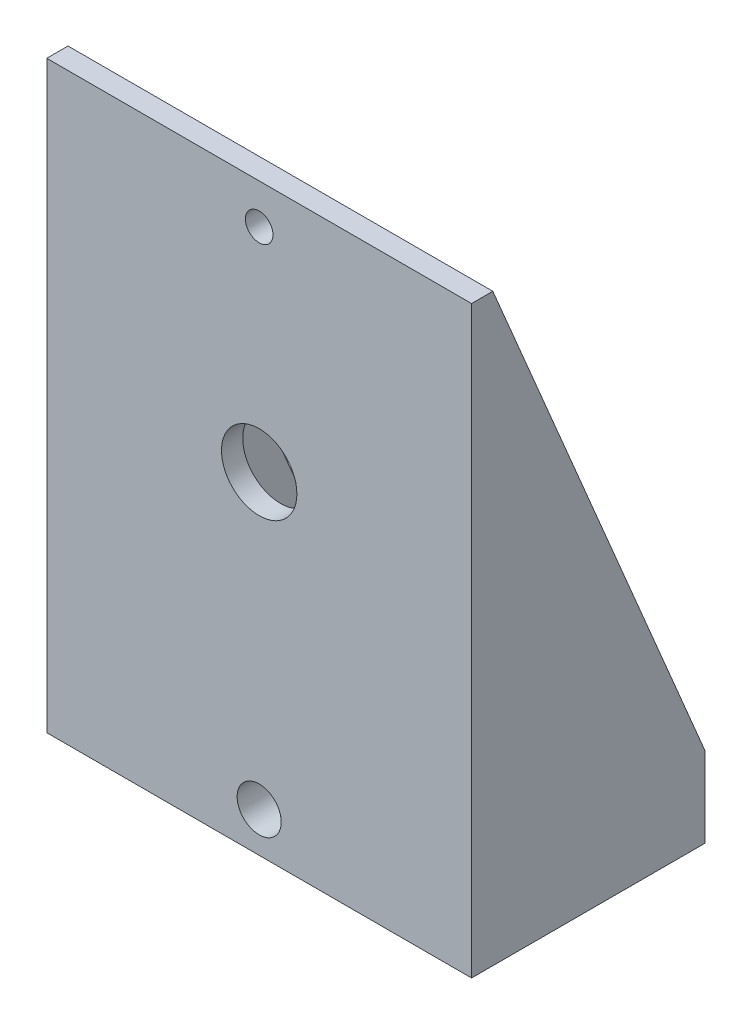
ISO-10303-21;
HEADER;
FILE_DESCRIPTION(('STEP AP214'),'2;1');
FILE_NAME('part.step','',(''),(''),'','','');
FILE_SCHEMA(('AUTOMOTIVE_DESIGN { 1 0 10303 214 1 1 1 1 }'));
ENDSEC;
DATA;
#1=APPLICATION_CONTEXT('core data for automotive mechanical design processes');
#2=APPLICATION_PROTOCOL_DEFINITION('international standard','automotive_design',2000,#1);
#3=PRODUCT_CONTEXT('',#1,'mechanical');
#4=PRODUCT('Part','Part','',(#3));
#5=PRODUCT_RELATED_PRODUCT_CATEGORY('part','',(#4));
#6=PRODUCT_DEFINITION_FORMATION('','',#4);
#7=PRODUCT_DEFINITION_CONTEXT('part definition',#1,'design');
#8=PRODUCT_DEFINITION('design','',#6,#7);
#9=PRODUCT_DEFINITION_SHAPE('','',#8);
#10=(LENGTH_UNIT() NAMED_UNIT(*) SI_UNIT(.MILLI.,.METRE.));
#11=(NAMED_UNIT(*) PLANE_ANGLE_UNIT() SI_UNIT($,.RADIAN.));
#12=(NAMED_UNIT(*) SI_UNIT($,.STERADIAN.) SOLID_ANGLE_UNIT());
#13=UNCERTAINTY_MEASURE_WITH_UNIT(LENGTH_MEASURE(1.E-05),#10,'distance_accuracy_value','');
#14=(GEOMETRIC_REPRESENTATION_CONTEXT(3) GLOBAL_UNCERTAINTY_ASSIGNED_CONTEXT((#13)) GLOBAL_UNIT_ASSIGNED_CONTEXT((#10,
#11,#12)) REPRESENTATION_CONTEXT('',''));
#15=CARTESIAN_POINT('',(0.,0.,0.));
#16=DIRECTION('',(0.,0.,1.));
#17=DIRECTION('',(1.,0.,0.));
#18=AXIS2_PLACEMENT_3D('',#15,#16,#17);
#19=CARTESIAN_POINT('',(0.,0.,0.));
#20=DIRECTION('',(0.,0.,1.));
#21=DIRECTION('',(1.,0.,0.));
#22=AXIS2_PLACEMENT_3D('',#19,#20,#21);
#23=PLANE('',#22);
#24=CARTESIAN_POINT('',(40.,-47.5,0.));
#25=DIRECTION('',(0.,0.,1.));
#26=DIRECTION('',(1.,0.,0.));
#27=AXIS2_PLACEMENT_3D('',#24,#25,#26);
#28=CIRCLE('',#27,7.1);
#29=CARTESIAN_POINT('',(47.1,-47.5,0.));
#30=VERTEX_POINT('',#29);
#31=EDGE_CURVE('E147',#30,#30,#28,.T.);
#32=ORIENTED_EDGE('',*,*,#31,.T.);
#33=EDGE_LOOP('',(#32));
#34=FACE_BOUND('',#33,.T.);
#35=CARTESIAN_POINT('',(40.,-7.50000000000001,0.));
#36=DIRECTION('',(0.,0.,1.));
#37=DIRECTION('',(1.,0.,0.));
#38=AXIS2_PLACEMENT_3D('',#35,#36,#37);
#39=CIRCLE('',#38,2.6);
#40=CARTESIAN_POINT('',(42.6,-7.50000000000001,0.));
#41=VERTEX_POINT('',#40);
#42=EDGE_CURVE('E160',#41,#41,#39,.T.);
#43=ORIENTED_EDGE('',*,*,#42,.T.);
#44=EDGE_LOOP('',(#43));
#45=FACE_BOUND('',#44,.T.);
#46=DIRECTION('',(0.,1.,0.));
#47=VECTOR('',#46,1.);
#48=CARTESIAN_POINT('',(7.,0.,0.));
#49=LINE('',#48,#47);
#50=CARTESIAN_POINT('',(7.00000000000001,-95.,0.));
#51=VERTEX_POINT('',#50);
#52=CARTESIAN_POINT('',(7.,0.,0.));
#53=VERTEX_POINT('',#52);
#54=EDGE_CURVE('E108',#51,#53,#49,.T.);
#55=ORIENTED_EDGE('',*,*,#54,.T.);
#56=DIRECTION('',(-1.,0.,0.));
#57=VECTOR('',#56,1.);
#58=CARTESIAN_POINT('',(0.,0.,0.));
#59=LINE('',#58,#57);
#60=CARTESIAN_POINT('',(73.,0.,0.));
#61=VERTEX_POINT('',#60);
#62=EDGE_CURVE('E151',#61,#53,#59,.T.);
#63=ORIENTED_EDGE('',*,*,#62,.F.);
#64=DIRECTION('',(0.,-1.,0.));
#65=VECTOR('',#64,1.);
#66=CARTESIAN_POINT('',(73.,0.,0.));
#67=LINE('',#66,#65);
#68=CARTESIAN_POINT('',(73.,-95.,0.));
#69=VERTEX_POINT('',#68);
#70=EDGE_CURVE('E130',#61,#69,#67,.T.);
#71=ORIENTED_EDGE('',*,*,#70,.T.);
#72=DIRECTION('',(1.,0.,0.));
#73=VECTOR('',#72,1.);
#74=CARTESIAN_POINT('',(80.,-95.,0.));
#75=LINE('',#74,#73);
#76=EDGE_CURVE('E123',#51,#69,#75,.T.);
#77=ORIENTED_EDGE('',*,*,#76,.F.);
#78=EDGE_LOOP('',(#55,#63,#71,#77));
#79=FACE_BOUND('',#78,.T.);
#80=ADVANCED_FACE('F43',(#34,#45,#79),#23,.F.);
#81=CARTESIAN_POINT('',(80.,-95.,-40.));
#82=DIRECTION('',(0.,-1.,0.));
#83=DIRECTION('',(0.,0.,-1.));
#84=AXIS2_PLACEMENT_3D('',#81,#82,#83);
#85=PLANE('',#84);
#86=DIRECTION('',(0.,0.,1.));
#87=VECTOR('',#86,1.);
#88=CARTESIAN_POINT('',(7.00000000000001,-95.,0.));
#89=LINE('',#88,#87);
#90=CARTESIAN_POINT('',(7.00000000000001,-95.,-40.));
#91=VERTEX_POINT('',#90);
#92=EDGE_CURVE('E111',#91,#51,#89,.T.);
#93=ORIENTED_EDGE('',*,*,#92,.T.);
#94=ORIENTED_EDGE('',*,*,#76,.T.);
#95=DIRECTION('',(0.,0.,-1.));
#96=VECTOR('',#95,1.);
#97=CARTESIAN_POINT('',(73.,-95.,0.));
#98=LINE('',#97,#96);
#99=CARTESIAN_POINT('',(73.,-95.,-40.));
#100=VERTEX_POINT('',#99);
#101=EDGE_CURVE('E213',#69,#100,#98,.T.);
#102=ORIENTED_EDGE('',*,*,#101,.T.);
#103=DIRECTION('',(1.,0.,0.));
#104=VECTOR('',#103,1.);
#105=CARTESIAN_POINT('',(80.,-95.,-40.));
#106=LINE('',#105,#104);
#107=EDGE_CURVE('E125',#91,#100,#106,.T.);
#108=ORIENTED_EDGE('',*,*,#107,.F.);
#109=EDGE_LOOP('',(#93,#94,#102,#108));
#110=FACE_BOUND('',#109,.T.);
#111=ADVANCED_FACE('F121',(#110),#85,.F.);
#112=CARTESIAN_POINT('',(0.,0.,4.));
#113=DIRECTION('',(1.,0.,0.));
#114=DIRECTION('',(0.,1.,0.));
#115=AXIS2_PLACEMENT_3D('',#112,#113,#114);
#116=PLANE('',#115);
#117=DIRECTION('',(0.,0.,-1.));
#118=VECTOR('',#117,1.);
#119=CARTESIAN_POINT('',(0.,0.,4.));
#120=LINE('',#119,#118);
#121=CARTESIAN_POINT('',(0.,0.,4.));
#122=VERTEX_POINT('',#121);
#123=CARTESIAN_POINT('',(0.,0.,0.));
#124=VERTEX_POINT('',#123);
#125=EDGE_CURVE('E176',#122,#124,#120,.T.);
#126=ORIENTED_EDGE('',*,*,#125,.T.);
#127=DIRECTION('',(0.,-0.921635375138065,-0.388057000058133));
#128=VECTOR('',#127,1.);
#129=CARTESIAN_POINT('',(0.,-95.,-40.));
#130=LINE('',#129,#128);
#131=CARTESIAN_POINT('',(0.,-95.,-40.));
#132=VERTEX_POINT('',#131);
#133=EDGE_CURVE('E227',#124,#132,#130,.T.);
#134=ORIENTED_EDGE('',*,*,#133,.T.);
#135=DIRECTION('',(0.,1.,0.));
#136=VECTOR('',#135,1.);
#137=CARTESIAN_POINT('',(0.,-95.,-40.));
#138=LINE('',#137,#136);
#139=CARTESIAN_POINT('',(0.,-110.,-40.));
#140=VERTEX_POINT('',#139);
#141=EDGE_CURVE('E203',#140,#132,#138,.T.);
#142=ORIENTED_EDGE('',*,*,#141,.F.);
#143=DIRECTION('',(0.,0.,-1.));
#144=VECTOR('',#143,1.);
#145=CARTESIAN_POINT('',(0.,-110.,4.));
#146=LINE('',#145,#144);
#147=CARTESIAN_POINT('',(0.,-110.,4.));
#148=VERTEX_POINT('',#147);
#149=EDGE_CURVE('E11',#148,#140,#146,.T.);
#150=ORIENTED_EDGE('',*,*,#149,.F.);
#151=DIRECTION('',(0.,-1.,0.));
#152=VECTOR('',#151,1.);
#153=CARTESIAN_POINT('',(0.,0.,4.));
#154=LINE('',#153,#152);
#155=EDGE_CURVE('E164',#122,#148,#154,.T.);
#156=ORIENTED_EDGE('',*,*,#155,.F.);
#157=EDGE_LOOP('',(#126,#134,#142,#150,#156));
#158=FACE_BOUND('',#157,.T.);
#159=ADVANCED_FACE('F45',(#158),#116,.F.);
#160=CARTESIAN_POINT('',(0.,-110.,4.));
#161=DIRECTION('',(0.,1.,0.));
#162=DIRECTION('',(0.,0.,1.));
#163=AXIS2_PLACEMENT_3D('',#160,#161,#162);
#164=PLANE('',#163);
#165=ORIENTED_EDGE('',*,*,#149,.T.);
#166=DIRECTION('',(-1.,0.,0.));
#167=VECTOR('',#166,1.);
#168=CARTESIAN_POINT('',(80.,-110.,-40.));
#169=LINE('',#168,#167);
#170=CARTESIAN_POINT('',(80.,-110.,-40.));
#171=VERTEX_POINT('',#170);
#172=EDGE_CURVE('E138',#171,#140,#169,.T.);
#173=ORIENTED_EDGE('',*,*,#172,.F.);
#174=DIRECTION('',(0.,0.,-1.));
#175=VECTOR('',#174,1.);
#176=CARTESIAN_POINT('',(80.,-110.,4.));
#177=LINE('',#176,#175);
#178=CARTESIAN_POINT('',(80.,-110.,4.));
#179=VERTEX_POINT('',#178);
#180=EDGE_CURVE('E52',#179,#171,#177,.T.);
#181=ORIENTED_EDGE('',*,*,#180,.F.);
#182=DIRECTION('',(1.,0.,0.));
#183=VECTOR('',#182,1.);
#184=CARTESIAN_POINT('',(0.,-110.,4.));
#185=LINE('',#184,#183);
#186=EDGE_CURVE('E167',#148,#179,#185,.T.);
#187=ORIENTED_EDGE('',*,*,#186,.F.);
#188=EDGE_LOOP('',(#165,#173,#181,#187));
#189=FACE_BOUND('',#188,.T.);
#190=ADVANCED_FACE('F197',(#189),#164,.F.);
#191=CARTESIAN_POINT('',(80.,0.,4.));
#192=DIRECTION('',(-1.,0.,0.));
#193=DIRECTION('',(0.,-1.,0.));
#194=AXIS2_PLACEMENT_3D('',#191,#192,#193);
#195=PLANE('',#194);
#196=DIRECTION('',(0.,0.921635375138065,0.388057000058133));
#197=VECTOR('',#196,1.);
#198=CARTESIAN_POINT('',(80.,-95.,-40.));
#199=LINE('',#198,#197);
#200=CARTESIAN_POINT('',(80.,-95.,-40.));
#201=VERTEX_POINT('',#200);
#202=CARTESIAN_POINT('',(80.,0.,0.));
#203=VERTEX_POINT('',#202);
#204=EDGE_CURVE('E221',#201,#203,#199,.T.);
#205=ORIENTED_EDGE('',*,*,#204,.T.);
#206=DIRECTION('',(0.,0.,-1.));
#207=VECTOR('',#206,1.);
#208=CARTESIAN_POINT('',(80.,0.,4.));
#209=LINE('',#208,#207);
#210=CARTESIAN_POINT('',(80.,0.,4.));
#211=VERTEX_POINT('',#210);
#212=EDGE_CURVE('E183',#211,#203,#209,.T.);
#213=ORIENTED_EDGE('',*,*,#212,.F.);
#214=DIRECTION('',(0.,1.,0.));
#215=VECTOR('',#214,1.);
#216=CARTESIAN_POINT('',(80.,0.,4.));
#217=LINE('',#216,#215);
#218=EDGE_CURVE('E171',#179,#211,#217,.T.);
#219=ORIENTED_EDGE('',*,*,#218,.F.);
#220=ORIENTED_EDGE('',*,*,#180,.T.);
#221=DIRECTION('',(0.,-1.,0.));
#222=VECTOR('',#221,1.);
#223=CARTESIAN_POINT('',(80.,-95.,-40.));
#224=LINE('',#223,#222);
#225=EDGE_CURVE('E132',#201,#171,#224,.T.);
#226=ORIENTED_EDGE('',*,*,#225,.F.);
#227=EDGE_LOOP('',(#205,#213,#219,#220,#226));
#228=FACE_BOUND('',#227,.T.);
#229=ADVANCED_FACE('F193',(#228),#195,.F.);
#230=CARTESIAN_POINT('',(0.,0.,4.));
#231=DIRECTION('',(0.,-1.,0.));
#232=DIRECTION('',(0.,0.,-1.));
#233=AXIS2_PLACEMENT_3D('',#230,#231,#232);
#234=PLANE('',#233);
#235=EDGE_CURVE('E168',#203,#61,#59,.T.);
#236=ORIENTED_EDGE('',*,*,#235,.T.);
#237=ORIENTED_EDGE('',*,*,#62,.T.);
#238=DIRECTION('',(-1.,0.,0.));
#239=VECTOR('',#238,1.);
#240=CARTESIAN_POINT('',(7.,0.,0.));
#241=LINE('',#240,#239);
#242=EDGE_CURVE('E118',#53,#124,#241,.T.);
#243=ORIENTED_EDGE('',*,*,#242,.T.);
#244=ORIENTED_EDGE('',*,*,#125,.F.);
#245=DIRECTION('',(-1.,0.,0.));
#246=VECTOR('',#245,1.);
#247=CARTESIAN_POINT('',(0.,0.,4.));
#248=LINE('',#247,#246);
#249=EDGE_CURVE('E67',#211,#122,#248,.T.);
#250=ORIENTED_EDGE('',*,*,#249,.F.);
#251=ORIENTED_EDGE('',*,*,#212,.T.);
#252=EDGE_LOOP('',(#236,#237,#243,#244,#250,#251));
#253=FACE_BOUND('',#252,.T.);
#254=ADVANCED_FACE('F244',(#253),#234,.F.);
#255=CARTESIAN_POINT('',(0.,0.,4.));
#256=DIRECTION('',(0.,0.,1.));
#257=DIRECTION('',(1.,0.,0.));
#258=AXIS2_PLACEMENT_3D('',#255,#256,#257);
#259=PLANE('',#258);
#260=CARTESIAN_POINT('',(40.,-102.5,4.));
#261=DIRECTION('',(0.,0.,-1.));
#262=DIRECTION('',(-1.,0.,0.));
#263=AXIS2_PLACEMENT_3D('',#260,#261,#262);
#264=CIRCLE('',#263,4.15);
#265=CARTESIAN_POINT('',(35.85,-102.5,4.));
#266=VERTEX_POINT('',#265);
#267=EDGE_CURVE('E133',#266,#266,#264,.T.);
#268=ORIENTED_EDGE('',*,*,#267,.T.);
#269=EDGE_LOOP('',(#268));
#270=FACE_BOUND('',#269,.T.);
#271=CARTESIAN_POINT('',(40.,-47.5,4.));
#272=DIRECTION('',(0.,0.,1.));
#273=DIRECTION('',(1.,0.,0.));
#274=AXIS2_PLACEMENT_3D('',#271,#272,#273);
#275=CIRCLE('',#274,7.1);
#276=CARTESIAN_POINT('',(47.1,-47.5,4.));
#277=VERTEX_POINT('',#276);
#278=EDGE_CURVE('E152',#277,#277,#275,.T.);
#279=ORIENTED_EDGE('',*,*,#278,.F.);
#280=EDGE_LOOP('',(#279));
#281=FACE_BOUND('',#280,.T.);
#282=CARTESIAN_POINT('',(40.,-7.50000000000001,4.));
#283=DIRECTION('',(0.,0.,1.));
#284=DIRECTION('',(1.,0.,0.));
#285=AXIS2_PLACEMENT_3D('',#282,#283,#284);
#286=CIRCLE('',#285,2.6);
#287=CARTESIAN_POINT('',(42.6,-7.50000000000001,4.));
#288=VERTEX_POINT('',#287);
#289=EDGE_CURVE('E156',#288,#288,#286,.T.);
#290=ORIENTED_EDGE('',*,*,#289,.F.);
#291=EDGE_LOOP('',(#290));
#292=FACE_BOUND('',#291,.T.);
#293=ORIENTED_EDGE('',*,*,#155,.T.);
#294=ORIENTED_EDGE('',*,*,#186,.T.);
#295=ORIENTED_EDGE('',*,*,#218,.T.);
#296=ORIENTED_EDGE('',*,*,#249,.T.);
#297=EDGE_LOOP('',(#293,#294,#295,#296));
#298=FACE_BOUND('',#297,.T.);
#299=ADVANCED_FACE('F245',(#270,#281,#292,#298),#259,.T.);
#300=CARTESIAN_POINT('',(40.,-7.50000000000001,0.));
#301=DIRECTION('',(0.,0.,1.));
#302=DIRECTION('',(1.,0.,0.));
#303=AXIS2_PLACEMENT_3D('',#300,#301,#302);
#304=CYLINDRICAL_SURFACE('',#303,2.6);
#305=ORIENTED_EDGE('',*,*,#42,.F.);
#306=EDGE_LOOP('',(#305));
#307=FACE_BOUND('',#306,.T.);
#308=ORIENTED_EDGE('',*,*,#289,.T.);
#309=EDGE_LOOP('',(#308));
#310=FACE_BOUND('',#309,.T.);
#311=ADVANCED_FACE('F247',(#307,#310),#304,.F.);
#312=CARTESIAN_POINT('',(40.,-47.5,0.));
#313=DIRECTION('',(0.,0.,1.));
#314=DIRECTION('',(1.,0.,0.));
#315=AXIS2_PLACEMENT_3D('',#312,#313,#314);
#316=CYLINDRICAL_SURFACE('',#315,7.1);
#317=ORIENTED_EDGE('',*,*,#31,.F.);
#318=EDGE_LOOP('',(#317));
#319=FACE_BOUND('',#318,.T.);
#320=ORIENTED_EDGE('',*,*,#278,.T.);
#321=EDGE_LOOP('',(#320));
#322=FACE_BOUND('',#321,.T.);
#323=ADVANCED_FACE('F254',(#319,#322),#316,.F.);
#324=CARTESIAN_POINT('',(0.,0.,-40.));
#325=DIRECTION('',(0.,0.,-1.));
#326=DIRECTION('',(-1.,0.,0.));
#327=AXIS2_PLACEMENT_3D('',#324,#325,#326);
#328=PLANE('',#327);
#329=CARTESIAN_POINT('',(40.,-102.5,-40.));
#330=DIRECTION('',(0.,0.,-1.));
#331=DIRECTION('',(-1.,0.,0.));
#332=AXIS2_PLACEMENT_3D('',#329,#330,#331);
#333=CIRCLE('',#332,4.15);
#334=CARTESIAN_POINT('',(35.85,-102.5,-40.));
#335=VERTEX_POINT('',#334);
#336=EDGE_CURVE('E141',#335,#335,#333,.T.);
#337=ORIENTED_EDGE('',*,*,#336,.F.);
#338=EDGE_LOOP('',(#337));
#339=FACE_BOUND('',#338,.T.);
#340=ORIENTED_EDGE('',*,*,#225,.T.);
#341=ORIENTED_EDGE('',*,*,#172,.T.);
#342=ORIENTED_EDGE('',*,*,#141,.T.);
#343=EDGE_CURVE('E145',#132,#91,#106,.T.);
#344=ORIENTED_EDGE('',*,*,#343,.T.);
#345=ORIENTED_EDGE('',*,*,#107,.T.);
#346=DIRECTION('',(1.,0.,0.));
#347=VECTOR('',#346,1.);
#348=CARTESIAN_POINT('',(73.,-95.,-40.));
#349=LINE('',#348,#347);
#350=EDGE_CURVE('E208',#100,#201,#349,.T.);
#351=ORIENTED_EDGE('',*,*,#350,.T.);
#352=EDGE_LOOP('',(#340,#341,#342,#344,#345,#351));
#353=FACE_BOUND('',#352,.T.);
#354=ADVANCED_FACE('F206',(#339,#353),#328,.T.);
#355=CARTESIAN_POINT('',(40.,-102.5,4.));
#356=DIRECTION('',(0.,0.,-1.));
#357=DIRECTION('',(-1.,0.,0.));
#358=AXIS2_PLACEMENT_3D('',#355,#356,#357);
#359=CYLINDRICAL_SURFACE('',#358,4.15);
#360=ORIENTED_EDGE('',*,*,#267,.F.);
#361=EDGE_LOOP('',(#360));
#362=FACE_BOUND('',#361,.T.);
#363=ORIENTED_EDGE('',*,*,#336,.T.);
#364=EDGE_LOOP('',(#363));
#365=FACE_BOUND('',#364,.T.);
#366=ADVANCED_FACE('F307',(#362,#365),#359,.F.);
#367=CARTESIAN_POINT('',(73.,-95.,-40.));
#368=DIRECTION('',(0.,0.388057000058133,-0.921635375138065));
#369=DIRECTION('',(0.,0.921635375138065,0.388057000058133));
#370=AXIS2_PLACEMENT_3D('',#367,#368,#369);
#371=PLANE('',#370);
#372=ORIENTED_EDGE('',*,*,#204,.F.);
#373=ORIENTED_EDGE('',*,*,#350,.F.);
#374=DIRECTION('',(0.,0.921635375138065,0.388057000058133));
#375=VECTOR('',#374,1.);
#376=CARTESIAN_POINT('',(73.,-95.,-40.));
#377=LINE('',#376,#375);
#378=EDGE_CURVE('E238',#100,#61,#377,.T.);
#379=ORIENTED_EDGE('',*,*,#378,.T.);
#380=ORIENTED_EDGE('',*,*,#235,.F.);
#381=EDGE_LOOP('',(#372,#373,#379,#380));
#382=FACE_BOUND('',#381,.T.);
#383=ADVANCED_FACE('F296',(#382),#371,.T.);
#384=CARTESIAN_POINT('',(73.,0.,0.));
#385=DIRECTION('',(-1.,0.,0.));
#386=DIRECTION('',(0.,-1.,0.));
#387=AXIS2_PLACEMENT_3D('',#384,#385,#386);
#388=PLANE('',#387);
#389=ORIENTED_EDGE('',*,*,#378,.F.);
#390=ORIENTED_EDGE('',*,*,#101,.F.);
#391=ORIENTED_EDGE('',*,*,#70,.F.);
#392=EDGE_LOOP('',(#389,#390,#391));
#393=FACE_BOUND('',#392,.T.);
#394=ADVANCED_FACE('F291',(#393),#388,.T.);
#395=CARTESIAN_POINT('',(7.00000000000001,-95.,-40.));
#396=DIRECTION('',(0.,0.388057000058133,-0.921635375138065));
#397=DIRECTION('',(0.,0.921635375138065,0.388057000058133));
#398=AXIS2_PLACEMENT_3D('',#395,#396,#397);
#399=PLANE('',#398);
#400=ORIENTED_EDGE('',*,*,#133,.F.);
#401=ORIENTED_EDGE('',*,*,#242,.F.);
#402=DIRECTION('',(0.,-0.921635375138065,-0.388057000058133));
#403=VECTOR('',#402,1.);
#404=CARTESIAN_POINT('',(7.00000000000001,-95.,-40.));
#405=LINE('',#404,#403);
#406=EDGE_CURVE('E59',#53,#91,#405,.T.);
#407=ORIENTED_EDGE('',*,*,#406,.T.);
#408=ORIENTED_EDGE('',*,*,#343,.F.);
#409=EDGE_LOOP('',(#400,#401,#407,#408));
#410=FACE_BOUND('',#409,.T.);
#411=ADVANCED_FACE('F226',(#410),#399,.T.);
#412=CARTESIAN_POINT('',(7.,0.,0.));
#413=DIRECTION('',(-1.,0.,0.));
#414=DIRECTION('',(0.,-1.,0.));
#415=AXIS2_PLACEMENT_3D('',#412,#413,#414);
#416=PLANE('',#415);
#417=ORIENTED_EDGE('',*,*,#406,.F.);
#418=ORIENTED_EDGE('',*,*,#54,.F.);
#419=ORIENTED_EDGE('',*,*,#92,.F.);
#420=EDGE_LOOP('',(#417,#418,#419));
#421=FACE_BOUND('',#420,.T.);
#422=ADVANCED_FACE('F110',(#421),#416,.F.);
#423=CLOSED_SHELL('',(#80,#111,#159,#190,#229,#254,#299,#311,#323,#354,#366,#383,#394,#411,#422));
#424=MANIFOLD_SOLID_BREP('B2',#423);
#425=ADVANCED_BREP_SHAPE_REPRESENTATION('',(#18,#424),#14);
#426=SHAPE_DEFINITION_REPRESENTATION(#9,#425);
ENDSEC;
END-ISO-10303-21;
